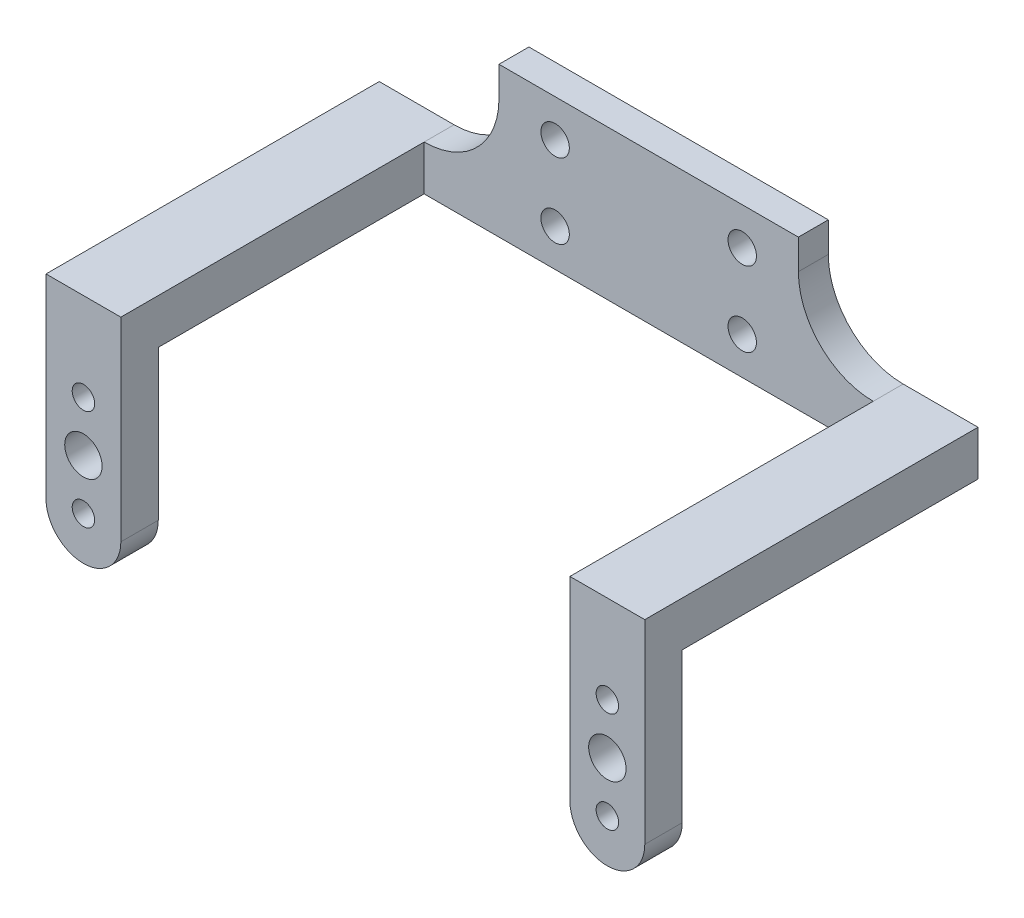
ISO-10303-21;
HEADER;
FILE_DESCRIPTION(('STEP AP214'),'2;1');
FILE_NAME('part.step','',(''),(''),'','','');
FILE_SCHEMA(('AUTOMOTIVE_DESIGN { 1 0 10303 214 1 1 1 1 }'));
ENDSEC;
DATA;
#1=APPLICATION_CONTEXT('core data for automotive mechanical design processes');
#2=APPLICATION_PROTOCOL_DEFINITION('international standard','automotive_design',2000,#1);
#3=PRODUCT_CONTEXT('',#1,'mechanical');
#4=PRODUCT('Part','Part','',(#3));
#5=PRODUCT_RELATED_PRODUCT_CATEGORY('part','',(#4));
#6=PRODUCT_DEFINITION_FORMATION('','',#4);
#7=PRODUCT_DEFINITION_CONTEXT('part definition',#1,'design');
#8=PRODUCT_DEFINITION('design','',#6,#7);
#9=PRODUCT_DEFINITION_SHAPE('','',#8);
#10=(LENGTH_UNIT() NAMED_UNIT(*) SI_UNIT(.MILLI.,.METRE.));
#11=(NAMED_UNIT(*) PLANE_ANGLE_UNIT() SI_UNIT($,.RADIAN.));
#12=(NAMED_UNIT(*) SI_UNIT($,.STERADIAN.) SOLID_ANGLE_UNIT());
#13=UNCERTAINTY_MEASURE_WITH_UNIT(LENGTH_MEASURE(1.E-05),#10,'distance_accuracy_value','');
#14=(GEOMETRIC_REPRESENTATION_CONTEXT(3) GLOBAL_UNCERTAINTY_ASSIGNED_CONTEXT((#13)) GLOBAL_UNIT_ASSIGNED_CONTEXT((#10,
#11,#12)) REPRESENTATION_CONTEXT('',''));
#15=CARTESIAN_POINT('',(0.,0.,0.));
#16=DIRECTION('',(0.,0.,1.));
#17=DIRECTION('',(1.,0.,0.));
#18=AXIS2_PLACEMENT_3D('',#15,#16,#17);
#19=CARTESIAN_POINT('',(0.,0.,44.52));
#20=DIRECTION('',(0.,0.,1.));
#21=DIRECTION('',(1.,0.,0.));
#22=AXIS2_PLACEMENT_3D('',#19,#20,#21);
#23=PLANE('',#22);
#24=CARTESIAN_POINT('',(35.,-5.77,44.52));
#25=DIRECTION('',(0.,0.,1.));
#26=DIRECTION('',(1.,0.,0.));
#27=AXIS2_PLACEMENT_3D('',#24,#25,#26);
#28=CIRCLE('',#27,1.5);
#29=CARTESIAN_POINT('',(36.5,-5.77,44.52));
#30=VERTEX_POINT('',#29);
#31=EDGE_CURVE('E401',#30,#30,#28,.F.);
#32=ORIENTED_EDGE('',*,*,#31,.T.);
#33=EDGE_LOOP('',(#32));
#34=FACE_BOUND('',#33,.T.);
#35=CARTESIAN_POINT('',(35.,-20.,44.52));
#36=DIRECTION('',(0.,0.,1.));
#37=DIRECTION('',(1.,0.,0.));
#38=AXIS2_PLACEMENT_3D('',#35,#36,#37);
#39=CIRCLE('',#38,5.);
#40=CARTESIAN_POINT('',(30.,-20.,44.52));
#41=VERTEX_POINT('',#40);
#42=CARTESIAN_POINT('',(35.,-25.,44.52));
#43=VERTEX_POINT('',#42);
#44=EDGE_CURVE('E299',#41,#43,#39,.T.);
#45=ORIENTED_EDGE('',*,*,#44,.T.);
#46=CARTESIAN_POINT('',(35.,-20.,44.52));
#47=DIRECTION('',(0.,0.,1.));
#48=DIRECTION('',(1.,0.,0.));
#49=AXIS2_PLACEMENT_3D('',#46,#47,#48);
#50=CIRCLE('',#49,5.);
#51=CARTESIAN_POINT('',(40.,-20.,44.52));
#52=VERTEX_POINT('',#51);
#53=EDGE_CURVE('E301',#43,#52,#50,.T.);
#54=ORIENTED_EDGE('',*,*,#53,.T.);
#55=DIRECTION('',(0.,1.,0.));
#56=VECTOR('',#55,1.);
#57=CARTESIAN_POINT('',(40.,0.,44.52));
#58=LINE('',#57,#56);
#59=CARTESIAN_POINT('',(40.,6.,44.52));
#60=VERTEX_POINT('',#59);
#61=EDGE_CURVE('E215',#52,#60,#58,.T.);
#62=ORIENTED_EDGE('',*,*,#61,.T.);
#63=DIRECTION('',(-1.,0.,0.));
#64=VECTOR('',#63,1.);
#65=CARTESIAN_POINT('',(40.,6.,44.52));
#66=LINE('',#65,#64);
#67=CARTESIAN_POINT('',(30.,6.,44.52));
#68=VERTEX_POINT('',#67);
#69=EDGE_CURVE('E272',#60,#68,#66,.T.);
#70=ORIENTED_EDGE('',*,*,#69,.T.);
#71=DIRECTION('',(0.,-1.,0.));
#72=VECTOR('',#71,1.);
#73=CARTESIAN_POINT('',(30.,0.,44.52));
#74=LINE('',#73,#72);
#75=EDGE_CURVE('E221',#68,#41,#74,.T.);
#76=ORIENTED_EDGE('',*,*,#75,.T.);
#77=EDGE_LOOP('',(#45,#54,#62,#70,#76));
#78=FACE_BOUND('',#77,.T.);
#79=CARTESIAN_POINT('',(35.,-12.5,44.52));
#80=DIRECTION('',(0.,0.,1.));
#81=DIRECTION('',(1.,0.,0.));
#82=AXIS2_PLACEMENT_3D('',#79,#80,#81);
#83=CIRCLE('',#82,2.5);
#84=CARTESIAN_POINT('',(37.5,-12.5,44.52));
#85=VERTEX_POINT('',#84);
#86=EDGE_CURVE('E389',#85,#85,#83,.F.);
#87=ORIENTED_EDGE('',*,*,#86,.T.);
#88=EDGE_LOOP('',(#87));
#89=FACE_BOUND('',#88,.T.);
#90=CARTESIAN_POINT('',(35.,-19.23,44.52));
#91=DIRECTION('',(0.,0.,1.));
#92=DIRECTION('',(1.,0.,0.));
#93=AXIS2_PLACEMENT_3D('',#90,#91,#92);
#94=CIRCLE('',#93,1.5);
#95=CARTESIAN_POINT('',(36.5,-19.23,44.52));
#96=VERTEX_POINT('',#95);
#97=EDGE_CURVE('E407',#96,#96,#94,.F.);
#98=ORIENTED_EDGE('',*,*,#97,.T.);
#99=EDGE_LOOP('',(#98));
#100=FACE_BOUND('',#99,.T.);
#101=ADVANCED_FACE('F33',(#34,#78,#89,#100),#23,.T.);
#102=CARTESIAN_POINT('',(30.,-25.,39.52));
#103=DIRECTION('',(0.,0.,1.));
#104=DIRECTION('',(1.,0.,0.));
#105=AXIS2_PLACEMENT_3D('',#102,#103,#104);
#106=PLANE('',#105);
#107=CARTESIAN_POINT('',(35.,-5.77,39.52));
#108=DIRECTION('',(0.,0.,1.));
#109=DIRECTION('',(1.,0.,0.));
#110=AXIS2_PLACEMENT_3D('',#107,#108,#109);
#111=CIRCLE('',#110,1.5);
#112=CARTESIAN_POINT('',(36.5,-5.77,39.52));
#113=VERTEX_POINT('',#112);
#114=EDGE_CURVE('E404',#113,#113,#111,.T.);
#115=ORIENTED_EDGE('',*,*,#114,.T.);
#116=EDGE_LOOP('',(#115));
#117=FACE_BOUND('',#116,.T.);
#118=DIRECTION('',(0.,1.,0.));
#119=VECTOR('',#118,1.);
#120=CARTESIAN_POINT('',(40.,-25.,39.52));
#121=LINE('',#120,#119);
#122=CARTESIAN_POINT('',(40.,-20.,39.52));
#123=VERTEX_POINT('',#122);
#124=CARTESIAN_POINT('',(40.,0.,39.52));
#125=VERTEX_POINT('',#124);
#126=EDGE_CURVE('E369',#123,#125,#121,.T.);
#127=ORIENTED_EDGE('',*,*,#126,.F.);
#128=CARTESIAN_POINT('',(35.,-20.,39.52));
#129=DIRECTION('',(0.,0.,1.));
#130=DIRECTION('',(1.,0.,0.));
#131=AXIS2_PLACEMENT_3D('',#128,#129,#130);
#132=CIRCLE('',#131,5.);
#133=CARTESIAN_POINT('',(35.,-25.,39.52));
#134=VERTEX_POINT('',#133);
#135=EDGE_CURVE('E308',#123,#134,#132,.F.);
#136=ORIENTED_EDGE('',*,*,#135,.T.);
#137=CARTESIAN_POINT('',(35.,-20.,39.52));
#138=DIRECTION('',(0.,0.,1.));
#139=DIRECTION('',(1.,0.,0.));
#140=AXIS2_PLACEMENT_3D('',#137,#138,#139);
#141=CIRCLE('',#140,5.);
#142=CARTESIAN_POINT('',(30.,-20.,39.52));
#143=VERTEX_POINT('',#142);
#144=EDGE_CURVE('E306',#134,#143,#141,.F.);
#145=ORIENTED_EDGE('',*,*,#144,.T.);
#146=DIRECTION('',(0.,1.,0.));
#147=VECTOR('',#146,1.);
#148=CARTESIAN_POINT('',(30.,-25.,39.52));
#149=LINE('',#148,#147);
#150=CARTESIAN_POINT('',(30.,0.,39.52));
#151=VERTEX_POINT('',#150);
#152=EDGE_CURVE('E248',#143,#151,#149,.T.);
#153=ORIENTED_EDGE('',*,*,#152,.T.);
#154=DIRECTION('',(1.,0.,0.));
#155=VECTOR('',#154,1.);
#156=CARTESIAN_POINT('',(30.,0.,39.52));
#157=LINE('',#156,#155);
#158=EDGE_CURVE('E363',#151,#125,#157,.T.);
#159=ORIENTED_EDGE('',*,*,#158,.T.);
#160=EDGE_LOOP('',(#127,#136,#145,#153,#159));
#161=FACE_BOUND('',#160,.T.);
#162=CARTESIAN_POINT('',(35.,-12.5,39.52));
#163=DIRECTION('',(0.,0.,1.));
#164=DIRECTION('',(1.,0.,0.));
#165=AXIS2_PLACEMENT_3D('',#162,#163,#164);
#166=CIRCLE('',#165,2.5);
#167=CARTESIAN_POINT('',(37.5,-12.5,39.52));
#168=VERTEX_POINT('',#167);
#169=EDGE_CURVE('E392',#168,#168,#166,.T.);
#170=ORIENTED_EDGE('',*,*,#169,.T.);
#171=EDGE_LOOP('',(#170));
#172=FACE_BOUND('',#171,.T.);
#173=CARTESIAN_POINT('',(35.,-19.23,39.52));
#174=DIRECTION('',(0.,0.,1.));
#175=DIRECTION('',(1.,0.,0.));
#176=AXIS2_PLACEMENT_3D('',#173,#174,#175);
#177=CIRCLE('',#176,1.5);
#178=CARTESIAN_POINT('',(36.5,-19.23,39.52));
#179=VERTEX_POINT('',#178);
#180=EDGE_CURVE('E410',#179,#179,#177,.T.);
#181=ORIENTED_EDGE('',*,*,#180,.T.);
#182=EDGE_LOOP('',(#181));
#183=FACE_BOUND('',#182,.T.);
#184=ADVANCED_FACE('F372',(#117,#161,#172,#183),#106,.F.);
#185=CARTESIAN_POINT('',(0.,0.,44.52));
#186=DIRECTION('',(0.,0.,1.));
#187=DIRECTION('',(1.,0.,0.));
#188=AXIS2_PLACEMENT_3D('',#185,#186,#187);
#189=PLANE('',#188);
#190=CARTESIAN_POINT('',(-35.,-5.76999999999999,44.52));
#191=DIRECTION('',(0.,0.,1.));
#192=DIRECTION('',(1.,0.,0.));
#193=AXIS2_PLACEMENT_3D('',#190,#191,#192);
#194=CIRCLE('',#193,1.5);
#195=CARTESIAN_POINT('',(-33.5,-5.76999999999999,44.52));
#196=VERTEX_POINT('',#195);
#197=EDGE_CURVE('E383',#196,#196,#194,.F.);
#198=ORIENTED_EDGE('',*,*,#197,.T.);
#199=EDGE_LOOP('',(#198));
#200=FACE_BOUND('',#199,.T.);
#201=DIRECTION('',(0.,-1.,0.));
#202=VECTOR('',#201,1.);
#203=CARTESIAN_POINT('',(-40.,0.,44.52));
#204=LINE('',#203,#202);
#205=CARTESIAN_POINT('',(-40.,6.,44.52));
#206=VERTEX_POINT('',#205);
#207=CARTESIAN_POINT('',(-40.,-20.,44.52));
#208=VERTEX_POINT('',#207);
#209=EDGE_CURVE('E260',#206,#208,#204,.T.);
#210=ORIENTED_EDGE('',*,*,#209,.T.);
#211=CARTESIAN_POINT('',(-35.,-20.,44.52));
#212=DIRECTION('',(0.,0.,1.));
#213=DIRECTION('',(1.,0.,0.));
#214=AXIS2_PLACEMENT_3D('',#211,#212,#213);
#215=CIRCLE('',#214,5.);
#216=CARTESIAN_POINT('',(-35.,-25.,44.52));
#217=VERTEX_POINT('',#216);
#218=EDGE_CURVE('E42',#208,#217,#215,.T.);
#219=ORIENTED_EDGE('',*,*,#218,.T.);
#220=CARTESIAN_POINT('',(-35.,-20.,44.52));
#221=DIRECTION('',(0.,0.,1.));
#222=DIRECTION('',(1.,0.,0.));
#223=AXIS2_PLACEMENT_3D('',#220,#221,#222);
#224=CIRCLE('',#223,5.);
#225=CARTESIAN_POINT('',(-30.,-20.,44.52));
#226=VERTEX_POINT('',#225);
#227=EDGE_CURVE('E50',#217,#226,#224,.T.);
#228=ORIENTED_EDGE('',*,*,#227,.T.);
#229=DIRECTION('',(0.,1.,0.));
#230=VECTOR('',#229,1.);
#231=CARTESIAN_POINT('',(-30.,0.,44.52));
#232=LINE('',#231,#230);
#233=CARTESIAN_POINT('',(-30.,6.,44.52));
#234=VERTEX_POINT('',#233);
#235=EDGE_CURVE('E255',#226,#234,#232,.T.);
#236=ORIENTED_EDGE('',*,*,#235,.T.);
#237=DIRECTION('',(-1.,0.,0.));
#238=VECTOR('',#237,1.);
#239=CARTESIAN_POINT('',(-40.,6.,44.52));
#240=LINE('',#239,#238);
#241=EDGE_CURVE('E257',#234,#206,#240,.T.);
#242=ORIENTED_EDGE('',*,*,#241,.T.);
#243=EDGE_LOOP('',(#210,#219,#228,#236,#242));
#244=FACE_BOUND('',#243,.T.);
#245=CARTESIAN_POINT('',(-35.,-19.23,44.52));
#246=DIRECTION('',(0.,0.,1.));
#247=DIRECTION('',(1.,0.,0.));
#248=AXIS2_PLACEMENT_3D('',#245,#246,#247);
#249=CIRCLE('',#248,1.5);
#250=CARTESIAN_POINT('',(-33.5,-19.23,44.52));
#251=VERTEX_POINT('',#250);
#252=EDGE_CURVE('E375',#251,#251,#249,.F.);
#253=ORIENTED_EDGE('',*,*,#252,.T.);
#254=EDGE_LOOP('',(#253));
#255=FACE_BOUND('',#254,.T.);
#256=CARTESIAN_POINT('',(-35.,-12.5,44.52));
#257=DIRECTION('',(0.,0.,1.));
#258=DIRECTION('',(1.,0.,0.));
#259=AXIS2_PLACEMENT_3D('',#256,#257,#258);
#260=CIRCLE('',#259,2.49999999999999);
#261=CARTESIAN_POINT('',(-32.5,-12.5,44.52));
#262=VERTEX_POINT('',#261);
#263=EDGE_CURVE('E395',#262,#262,#260,.F.);
#264=ORIENTED_EDGE('',*,*,#263,.T.);
#265=EDGE_LOOP('',(#264));
#266=FACE_BOUND('',#265,.T.);
#267=ADVANCED_FACE('F457',(#200,#244,#255,#266),#189,.T.);
#268=CARTESIAN_POINT('',(-30.,-25.,39.52));
#269=DIRECTION('',(0.,0.,1.));
#270=DIRECTION('',(1.,0.,0.));
#271=AXIS2_PLACEMENT_3D('',#268,#269,#270);
#272=PLANE('',#271);
#273=CARTESIAN_POINT('',(-35.,-5.76999999999999,39.52));
#274=DIRECTION('',(0.,0.,1.));
#275=DIRECTION('',(-1.,0.,0.));
#276=AXIS2_PLACEMENT_3D('',#273,#274,#275);
#277=CIRCLE('',#276,1.5);
#278=CARTESIAN_POINT('',(-36.5,-5.76999999999999,39.52));
#279=VERTEX_POINT('',#278);
#280=EDGE_CURVE('E386',#279,#279,#277,.T.);
#281=ORIENTED_EDGE('',*,*,#280,.T.);
#282=EDGE_LOOP('',(#281));
#283=FACE_BOUND('',#282,.T.);
#284=CARTESIAN_POINT('',(-35.,-20.,39.52));
#285=DIRECTION('',(0.,0.,1.));
#286=DIRECTION('',(1.,0.,0.));
#287=AXIS2_PLACEMENT_3D('',#284,#285,#286);
#288=CIRCLE('',#287,5.);
#289=CARTESIAN_POINT('',(-30.,-20.,39.52));
#290=VERTEX_POINT('',#289);
#291=CARTESIAN_POINT('',(-35.,-25.,39.52));
#292=VERTEX_POINT('',#291);
#293=EDGE_CURVE('E312',#290,#292,#288,.F.);
#294=ORIENTED_EDGE('',*,*,#293,.T.);
#295=CARTESIAN_POINT('',(-35.,-20.,39.52));
#296=DIRECTION('',(0.,0.,1.));
#297=DIRECTION('',(1.,0.,0.));
#298=AXIS2_PLACEMENT_3D('',#295,#296,#297);
#299=CIRCLE('',#298,5.);
#300=CARTESIAN_POINT('',(-40.,-20.,39.52));
#301=VERTEX_POINT('',#300);
#302=EDGE_CURVE('E316',#292,#301,#299,.F.);
#303=ORIENTED_EDGE('',*,*,#302,.T.);
#304=DIRECTION('',(0.,1.,0.));
#305=VECTOR('',#304,1.);
#306=CARTESIAN_POINT('',(-40.,-25.,39.52));
#307=LINE('',#306,#305);
#308=CARTESIAN_POINT('',(-40.,0.,39.52));
#309=VERTEX_POINT('',#308);
#310=EDGE_CURVE('E265',#301,#309,#307,.T.);
#311=ORIENTED_EDGE('',*,*,#310,.T.);
#312=DIRECTION('',(1.,0.,0.));
#313=VECTOR('',#312,1.);
#314=CARTESIAN_POINT('',(-30.,0.,39.52));
#315=LINE('',#314,#313);
#316=CARTESIAN_POINT('',(-30.,0.,39.52));
#317=VERTEX_POINT('',#316);
#318=EDGE_CURVE('E243',#309,#317,#315,.T.);
#319=ORIENTED_EDGE('',*,*,#318,.T.);
#320=DIRECTION('',(0.,1.,0.));
#321=VECTOR('',#320,1.);
#322=CARTESIAN_POINT('',(-30.,-25.,39.52));
#323=LINE('',#322,#321);
#324=EDGE_CURVE('E247',#290,#317,#323,.T.);
#325=ORIENTED_EDGE('',*,*,#324,.F.);
#326=EDGE_LOOP('',(#294,#303,#311,#319,#325));
#327=FACE_BOUND('',#326,.T.);
#328=CARTESIAN_POINT('',(-35.,-19.23,39.52));
#329=DIRECTION('',(0.,0.,1.));
#330=DIRECTION('',(-1.,0.,0.));
#331=AXIS2_PLACEMENT_3D('',#328,#329,#330);
#332=CIRCLE('',#331,1.5);
#333=CARTESIAN_POINT('',(-36.5,-19.23,39.52));
#334=VERTEX_POINT('',#333);
#335=EDGE_CURVE('E378',#334,#334,#332,.T.);
#336=ORIENTED_EDGE('',*,*,#335,.T.);
#337=EDGE_LOOP('',(#336));
#338=FACE_BOUND('',#337,.T.);
#339=CARTESIAN_POINT('',(-35.,-12.5,39.52));
#340=DIRECTION('',(0.,0.,1.));
#341=DIRECTION('',(-1.,0.,0.));
#342=AXIS2_PLACEMENT_3D('',#339,#340,#341);
#343=CIRCLE('',#342,2.49999999999999);
#344=CARTESIAN_POINT('',(-37.5,-12.5,39.52));
#345=VERTEX_POINT('',#344);
#346=EDGE_CURVE('E398',#345,#345,#343,.T.);
#347=ORIENTED_EDGE('',*,*,#346,.T.);
#348=EDGE_LOOP('',(#347));
#349=FACE_BOUND('',#348,.T.);
#350=ADVANCED_FACE('F341',(#283,#327,#338,#349),#272,.F.);
#351=CARTESIAN_POINT('',(-20.,0.,4.));
#352=DIRECTION('',(0.,1.,0.));
#353=DIRECTION('',(0.,0.,1.));
#354=AXIS2_PLACEMENT_3D('',#351,#352,#353);
#355=PLANE('',#354);
#356=ORIENTED_EDGE('',*,*,#158,.F.);
#357=DIRECTION('',(0.,0.,-1.));
#358=VECTOR('',#357,1.);
#359=CARTESIAN_POINT('',(30.,0.,44.52));
#360=LINE('',#359,#358);
#361=CARTESIAN_POINT('',(30.,0.,4.));
#362=VERTEX_POINT('',#361);
#363=EDGE_CURVE('E225',#151,#362,#360,.T.);
#364=ORIENTED_EDGE('',*,*,#363,.T.);
#365=DIRECTION('',(1.,0.,0.));
#366=VECTOR('',#365,1.);
#367=CARTESIAN_POINT('',(-20.,0.,4.));
#368=LINE('',#367,#366);
#369=CARTESIAN_POINT('',(-30.,0.,4.));
#370=VERTEX_POINT('',#369);
#371=EDGE_CURVE('E188',#370,#362,#368,.T.);
#372=ORIENTED_EDGE('',*,*,#371,.F.);
#373=DIRECTION('',(0.,0.,-1.));
#374=VECTOR('',#373,1.);
#375=CARTESIAN_POINT('',(-30.,0.,44.52));
#376=LINE('',#375,#374);
#377=EDGE_CURVE('E216',#317,#370,#376,.T.);
#378=ORIENTED_EDGE('',*,*,#377,.F.);
#379=ORIENTED_EDGE('',*,*,#318,.F.);
#380=DIRECTION('',(0.,0.,-1.));
#381=VECTOR('',#380,1.);
#382=CARTESIAN_POINT('',(-40.,0.,32.2842712474619));
#383=LINE('',#382,#381);
#384=CARTESIAN_POINT('',(-40.,0.,0.));
#385=VERTEX_POINT('',#384);
#386=EDGE_CURVE('E233',#309,#385,#383,.T.);
#387=ORIENTED_EDGE('',*,*,#386,.T.);
#388=DIRECTION('',(1.,0.,0.));
#389=VECTOR('',#388,1.);
#390=CARTESIAN_POINT('',(-20.,0.,0.));
#391=LINE('',#390,#389);
#392=CARTESIAN_POINT('',(40.,0.,0.));
#393=VERTEX_POINT('',#392);
#394=EDGE_CURVE('E200',#385,#393,#391,.T.);
#395=ORIENTED_EDGE('',*,*,#394,.T.);
#396=DIRECTION('',(0.,0.,-1.));
#397=VECTOR('',#396,1.);
#398=CARTESIAN_POINT('',(40.,0.,32.2842712474619));
#399=LINE('',#398,#397);
#400=EDGE_CURVE('E227',#125,#393,#399,.T.);
#401=ORIENTED_EDGE('',*,*,#400,.F.);
#402=EDGE_LOOP('',(#356,#364,#372,#378,#379,#387,#395,#401));
#403=FACE_BOUND('',#402,.T.);
#404=ADVANCED_FACE('F346',(#403),#355,.F.);
#405=CARTESIAN_POINT('',(0.,0.,4.));
#406=DIRECTION('',(0.,0.,-1.));
#407=DIRECTION('',(-1.,0.,0.));
#408=AXIS2_PLACEMENT_3D('',#405,#406,#407);
#409=PLANE('',#408);
#410=CARTESIAN_POINT('',(12.5,5.,4.));
#411=DIRECTION('',(0.,0.,1.));
#412=DIRECTION('',(-1.,0.,0.));
#413=AXIS2_PLACEMENT_3D('',#410,#411,#412);
#414=CIRCLE('',#413,1.90000000000001);
#415=CARTESIAN_POINT('',(10.6,5.,4.));
#416=VERTEX_POINT('',#415);
#417=EDGE_CURVE('E813',#416,#416,#414,.T.);
#418=ORIENTED_EDGE('',*,*,#417,.F.);
#419=EDGE_LOOP('',(#418));
#420=FACE_BOUND('',#419,.T.);
#421=CARTESIAN_POINT('',(-12.5,15.,4.));
#422=DIRECTION('',(0.,0.,1.));
#423=DIRECTION('',(1.,0.,0.));
#424=AXIS2_PLACEMENT_3D('',#421,#422,#423);
#425=CIRCLE('',#424,1.9);
#426=CARTESIAN_POINT('',(-10.6,15.,4.));
#427=VERTEX_POINT('',#426);
#428=EDGE_CURVE('E203',#427,#427,#425,.T.);
#429=ORIENTED_EDGE('',*,*,#428,.F.);
#430=EDGE_LOOP('',(#429));
#431=FACE_BOUND('',#430,.T.);
#432=CARTESIAN_POINT('',(-12.5,5.,4.));
#433=DIRECTION('',(0.,0.,1.));
#434=DIRECTION('',(1.,0.,0.));
#435=AXIS2_PLACEMENT_3D('',#432,#433,#434);
#436=CIRCLE('',#435,1.9);
#437=CARTESIAN_POINT('',(-10.6,5.,4.));
#438=VERTEX_POINT('',#437);
#439=EDGE_CURVE('E820',#438,#438,#436,.T.);
#440=ORIENTED_EDGE('',*,*,#439,.F.);
#441=EDGE_LOOP('',(#440));
#442=FACE_BOUND('',#441,.T.);
#443=CARTESIAN_POINT('',(12.5,15.,4.));
#444=DIRECTION('',(0.,0.,1.));
#445=DIRECTION('',(-1.,0.,0.));
#446=AXIS2_PLACEMENT_3D('',#443,#444,#445);
#447=CIRCLE('',#446,1.90000000000001);
#448=CARTESIAN_POINT('',(10.6,15.,4.));
#449=VERTEX_POINT('',#448);
#450=EDGE_CURVE('E236',#449,#449,#447,.T.);
#451=ORIENTED_EDGE('',*,*,#450,.F.);
#452=EDGE_LOOP('',(#451));
#453=FACE_BOUND('',#452,.T.);
#454=DIRECTION('',(0.,-1.,0.));
#455=VECTOR('',#454,1.);
#456=CARTESIAN_POINT('',(30.,0.,4.));
#457=LINE('',#456,#455);
#458=CARTESIAN_POINT('',(30.,6.,4.));
#459=VERTEX_POINT('',#458);
#460=EDGE_CURVE('E211',#459,#362,#457,.T.);
#461=ORIENTED_EDGE('',*,*,#460,.F.);
#462=CARTESIAN_POINT('',(30.,16.,4.));
#463=DIRECTION('',(0.,0.,-1.));
#464=DIRECTION('',(-1.,0.,0.));
#465=AXIS2_PLACEMENT_3D('',#462,#463,#464);
#466=CIRCLE('',#465,10.);
#467=CARTESIAN_POINT('',(20.,16.,4.));
#468=VERTEX_POINT('',#467);
#469=EDGE_CURVE('E181',#459,#468,#466,.T.);
#470=ORIENTED_EDGE('',*,*,#469,.T.);
#471=DIRECTION('',(0.,-1.,0.));
#472=VECTOR('',#471,1.);
#473=CARTESIAN_POINT('',(20.,6.,4.));
#474=LINE('',#473,#472);
#475=CARTESIAN_POINT('',(20.,20.,4.));
#476=VERTEX_POINT('',#475);
#477=EDGE_CURVE('E165',#476,#468,#474,.T.);
#478=ORIENTED_EDGE('',*,*,#477,.F.);
#479=DIRECTION('',(-1.,0.,0.));
#480=VECTOR('',#479,1.);
#481=CARTESIAN_POINT('',(-20.,20.,4.));
#482=LINE('',#481,#480);
#483=CARTESIAN_POINT('',(-20.,20.,4.));
#484=VERTEX_POINT('',#483);
#485=EDGE_CURVE('E179',#476,#484,#482,.T.);
#486=ORIENTED_EDGE('',*,*,#485,.T.);
#487=DIRECTION('',(0.,1.,0.));
#488=VECTOR('',#487,1.);
#489=CARTESIAN_POINT('',(-20.,6.,4.));
#490=LINE('',#489,#488);
#491=CARTESIAN_POINT('',(-20.,16.,4.));
#492=VERTEX_POINT('',#491);
#493=EDGE_CURVE('E418',#492,#484,#490,.T.);
#494=ORIENTED_EDGE('',*,*,#493,.F.);
#495=CARTESIAN_POINT('',(-30.,16.,4.));
#496=DIRECTION('',(0.,0.,-1.));
#497=DIRECTION('',(-1.,0.,0.));
#498=AXIS2_PLACEMENT_3D('',#495,#496,#497);
#499=CIRCLE('',#498,10.);
#500=CARTESIAN_POINT('',(-30.,6.,4.));
#501=VERTEX_POINT('',#500);
#502=EDGE_CURVE('E295',#492,#501,#499,.T.);
#503=ORIENTED_EDGE('',*,*,#502,.T.);
#504=DIRECTION('',(0.,1.,0.));
#505=VECTOR('',#504,1.);
#506=CARTESIAN_POINT('',(-30.,0.,4.));
#507=LINE('',#506,#505);
#508=EDGE_CURVE('E258',#370,#501,#507,.T.);
#509=ORIENTED_EDGE('',*,*,#508,.F.);
#510=ORIENTED_EDGE('',*,*,#371,.T.);
#511=EDGE_LOOP('',(#461,#470,#478,#486,#494,#503,#509,#510));
#512=FACE_BOUND('',#511,.T.);
#513=ADVANCED_FACE('F177',(#420,#431,#442,#453,#512),#409,.F.);
#514=CARTESIAN_POINT('',(0.,0.,0.));
#515=DIRECTION('',(0.,0.,-1.));
#516=DIRECTION('',(-1.,0.,0.));
#517=AXIS2_PLACEMENT_3D('',#514,#515,#516);
#518=PLANE('',#517);
#519=DIRECTION('',(-1.,0.,0.));
#520=VECTOR('',#519,1.);
#521=CARTESIAN_POINT('',(0.,6.,0.));
#522=LINE('',#521,#520);
#523=CARTESIAN_POINT('',(40.,6.,0.));
#524=VERTEX_POINT('',#523);
#525=CARTESIAN_POINT('',(30.,6.,0.));
#526=VERTEX_POINT('',#525);
#527=EDGE_CURVE('E172',#524,#526,#522,.T.);
#528=ORIENTED_EDGE('',*,*,#527,.F.);
#529=DIRECTION('',(0.,-1.,0.));
#530=VECTOR('',#529,1.);
#531=CARTESIAN_POINT('',(40.,0.,0.));
#532=LINE('',#531,#530);
#533=EDGE_CURVE('E207',#524,#393,#532,.T.);
#534=ORIENTED_EDGE('',*,*,#533,.T.);
#535=ORIENTED_EDGE('',*,*,#394,.F.);
#536=DIRECTION('',(0.,1.,0.));
#537=VECTOR('',#536,1.);
#538=CARTESIAN_POINT('',(-40.,0.,0.));
#539=LINE('',#538,#537);
#540=CARTESIAN_POINT('',(-40.,6.,0.));
#541=VERTEX_POINT('',#540);
#542=EDGE_CURVE('E230',#385,#541,#539,.T.);
#543=ORIENTED_EDGE('',*,*,#542,.T.);
#544=DIRECTION('',(-1.,0.,0.));
#545=VECTOR('',#544,1.);
#546=CARTESIAN_POINT('',(0.,6.,0.));
#547=LINE('',#546,#545);
#548=CARTESIAN_POINT('',(-30.,6.,0.));
#549=VERTEX_POINT('',#548);
#550=EDGE_CURVE('E358',#549,#541,#547,.T.);
#551=ORIENTED_EDGE('',*,*,#550,.F.);
#552=CARTESIAN_POINT('',(-30.,16.,0.));
#553=DIRECTION('',(0.,0.,-1.));
#554=DIRECTION('',(-1.,0.,0.));
#555=AXIS2_PLACEMENT_3D('',#552,#553,#554);
#556=CIRCLE('',#555,10.);
#557=CARTESIAN_POINT('',(-20.,16.,0.));
#558=VERTEX_POINT('',#557);
#559=EDGE_CURVE('E297',#549,#558,#556,.F.);
#560=ORIENTED_EDGE('',*,*,#559,.T.);
#561=DIRECTION('',(0.,-1.,0.));
#562=VECTOR('',#561,1.);
#563=CARTESIAN_POINT('',(-20.,0.,0.));
#564=LINE('',#563,#562);
#565=CARTESIAN_POINT('',(-20.,20.,0.));
#566=VERTEX_POINT('',#565);
#567=EDGE_CURVE('E413',#566,#558,#564,.T.);
#568=ORIENTED_EDGE('',*,*,#567,.F.);
#569=DIRECTION('',(-1.,0.,0.));
#570=VECTOR('',#569,1.);
#571=CARTESIAN_POINT('',(-20.,20.,0.));
#572=LINE('',#571,#570);
#573=CARTESIAN_POINT('',(20.,20.,0.));
#574=VERTEX_POINT('',#573);
#575=EDGE_CURVE('E194',#574,#566,#572,.T.);
#576=ORIENTED_EDGE('',*,*,#575,.F.);
#577=DIRECTION('',(0.,1.,0.));
#578=VECTOR('',#577,1.);
#579=CARTESIAN_POINT('',(20.,0.,0.));
#580=LINE('',#579,#578);
#581=CARTESIAN_POINT('',(20.,16.,0.));
#582=VERTEX_POINT('',#581);
#583=EDGE_CURVE('E168',#582,#574,#580,.T.);
#584=ORIENTED_EDGE('',*,*,#583,.F.);
#585=CARTESIAN_POINT('',(30.,16.,0.));
#586=DIRECTION('',(0.,0.,-1.));
#587=DIRECTION('',(-1.,0.,0.));
#588=AXIS2_PLACEMENT_3D('',#585,#586,#587);
#589=CIRCLE('',#588,10.);
#590=EDGE_CURVE('E293',#582,#526,#589,.F.);
#591=ORIENTED_EDGE('',*,*,#590,.T.);
#592=EDGE_LOOP('',(#528,#534,#535,#543,#551,#560,#568,#576,#584,#591));
#593=FACE_BOUND('',#592,.T.);
#594=CARTESIAN_POINT('',(12.5,5.,0.));
#595=DIRECTION('',(0.,0.,1.));
#596=DIRECTION('',(-1.,0.,0.));
#597=AXIS2_PLACEMENT_3D('',#594,#595,#596);
#598=CIRCLE('',#597,1.90000000000001);
#599=CARTESIAN_POINT('',(10.6,5.,0.));
#600=VERTEX_POINT('',#599);
#601=EDGE_CURVE('E823',#600,#600,#598,.T.);
#602=ORIENTED_EDGE('',*,*,#601,.T.);
#603=EDGE_LOOP('',(#602));
#604=FACE_BOUND('',#603,.T.);
#605=CARTESIAN_POINT('',(-12.5,15.,0.));
#606=DIRECTION('',(0.,0.,1.));
#607=DIRECTION('',(1.,0.,0.));
#608=AXIS2_PLACEMENT_3D('',#605,#606,#607);
#609=CIRCLE('',#608,1.9);
#610=CARTESIAN_POINT('',(-10.6,15.,0.));
#611=VERTEX_POINT('',#610);
#612=EDGE_CURVE('E833',#611,#611,#609,.T.);
#613=ORIENTED_EDGE('',*,*,#612,.T.);
#614=EDGE_LOOP('',(#613));
#615=FACE_BOUND('',#614,.T.);
#616=CARTESIAN_POINT('',(-12.5,5.,0.));
#617=DIRECTION('',(0.,0.,1.));
#618=DIRECTION('',(1.,0.,0.));
#619=AXIS2_PLACEMENT_3D('',#616,#617,#618);
#620=CIRCLE('',#619,1.9);
#621=CARTESIAN_POINT('',(-10.6,5.,0.));
#622=VERTEX_POINT('',#621);
#623=EDGE_CURVE('E830',#622,#622,#620,.T.);
#624=ORIENTED_EDGE('',*,*,#623,.T.);
#625=EDGE_LOOP('',(#624));
#626=FACE_BOUND('',#625,.T.);
#627=CARTESIAN_POINT('',(12.5,15.,0.));
#628=DIRECTION('',(0.,0.,1.));
#629=DIRECTION('',(-1.,0.,0.));
#630=AXIS2_PLACEMENT_3D('',#627,#628,#629);
#631=CIRCLE('',#630,1.90000000000001);
#632=CARTESIAN_POINT('',(10.6,15.,0.));
#633=VERTEX_POINT('',#632);
#634=EDGE_CURVE('E241',#633,#633,#631,.T.);
#635=ORIENTED_EDGE('',*,*,#634,.T.);
#636=EDGE_LOOP('',(#635));
#637=FACE_BOUND('',#636,.T.);
#638=ADVANCED_FACE('F356',(#593,#604,#615,#626,#637),#518,.T.);
#639=CARTESIAN_POINT('',(-20.,20.,4.));
#640=DIRECTION('',(0.,-1.,0.));
#641=DIRECTION('',(0.,0.,-1.));
#642=AXIS2_PLACEMENT_3D('',#639,#640,#641);
#643=PLANE('',#642);
#644=ORIENTED_EDGE('',*,*,#485,.F.);
#645=DIRECTION('',(0.,0.,1.));
#646=VECTOR('',#645,1.);
#647=CARTESIAN_POINT('',(20.,20.,-2.49999999998515E-05));
#648=LINE('',#647,#646);
#649=EDGE_CURVE('E162',#574,#476,#648,.T.);
#650=ORIENTED_EDGE('',*,*,#649,.F.);
#651=ORIENTED_EDGE('',*,*,#575,.T.);
#652=DIRECTION('',(0.,0.,1.));
#653=VECTOR('',#652,1.);
#654=CARTESIAN_POINT('',(-20.,20.,-2.49999999998515E-05));
#655=LINE('',#654,#653);
#656=EDGE_CURVE('E186',#566,#484,#655,.T.);
#657=ORIENTED_EDGE('',*,*,#656,.T.);
#658=EDGE_LOOP('',(#644,#650,#651,#657));
#659=FACE_BOUND('',#658,.T.);
#660=ADVANCED_FACE('F184',(#659),#643,.F.);
#661=CARTESIAN_POINT('',(-12.5,15.,4.));
#662=DIRECTION('',(0.,0.,-1.));
#663=DIRECTION('',(-1.,0.,0.));
#664=AXIS2_PLACEMENT_3D('',#661,#662,#663);
#665=CYLINDRICAL_SURFACE('',#664,1.9);
#666=ORIENTED_EDGE('',*,*,#428,.T.);
#667=EDGE_LOOP('',(#666));
#668=FACE_BOUND('',#667,.T.);
#669=ORIENTED_EDGE('',*,*,#612,.F.);
#670=EDGE_LOOP('',(#669));
#671=FACE_BOUND('',#670,.T.);
#672=ADVANCED_FACE('F484',(#668,#671),#665,.F.);
#673=CARTESIAN_POINT('',(-12.5,5.,4.));
#674=DIRECTION('',(0.,0.,-1.));
#675=DIRECTION('',(-1.,0.,0.));
#676=AXIS2_PLACEMENT_3D('',#673,#674,#675);
#677=CYLINDRICAL_SURFACE('',#676,1.9);
#678=ORIENTED_EDGE('',*,*,#439,.T.);
#679=EDGE_LOOP('',(#678));
#680=FACE_BOUND('',#679,.T.);
#681=ORIENTED_EDGE('',*,*,#623,.F.);
#682=EDGE_LOOP('',(#681));
#683=FACE_BOUND('',#682,.T.);
#684=ADVANCED_FACE('F480',(#680,#683),#677,.F.);
#685=CARTESIAN_POINT('',(12.5,5.,4.));
#686=DIRECTION('',(0.,0.,-1.));
#687=DIRECTION('',(-1.,0.,0.));
#688=AXIS2_PLACEMENT_3D('',#685,#686,#687);
#689=CYLINDRICAL_SURFACE('',#688,1.90000000000001);
#690=ORIENTED_EDGE('',*,*,#417,.T.);
#691=EDGE_LOOP('',(#690));
#692=FACE_BOUND('',#691,.T.);
#693=ORIENTED_EDGE('',*,*,#601,.F.);
#694=EDGE_LOOP('',(#693));
#695=FACE_BOUND('',#694,.T.);
#696=ADVANCED_FACE('F476',(#692,#695),#689,.F.);
#697=CARTESIAN_POINT('',(12.5,15.,4.));
#698=DIRECTION('',(0.,0.,-1.));
#699=DIRECTION('',(-1.,0.,0.));
#700=AXIS2_PLACEMENT_3D('',#697,#698,#699);
#701=CYLINDRICAL_SURFACE('',#700,1.90000000000001);
#702=ORIENTED_EDGE('',*,*,#450,.T.);
#703=EDGE_LOOP('',(#702));
#704=FACE_BOUND('',#703,.T.);
#705=ORIENTED_EDGE('',*,*,#634,.F.);
#706=EDGE_LOOP('',(#705));
#707=FACE_BOUND('',#706,.T.);
#708=ADVANCED_FACE('F473',(#704,#707),#701,.F.);
#709=CARTESIAN_POINT('',(-40.,0.,32.2842712474619));
#710=DIRECTION('',(-1.,0.,0.));
#711=DIRECTION('',(0.,0.,1.));
#712=AXIS2_PLACEMENT_3D('',#709,#710,#711);
#713=PLANE('',#712);
#714=ORIENTED_EDGE('',*,*,#310,.F.);
#715=DIRECTION('',(0.,0.,-1.));
#716=VECTOR('',#715,1.);
#717=CARTESIAN_POINT('',(-40.,-20.,44.52));
#718=LINE('',#717,#716);
#719=EDGE_CURVE('E318',#301,#208,#718,.F.);
#720=ORIENTED_EDGE('',*,*,#719,.T.);
#721=ORIENTED_EDGE('',*,*,#209,.F.);
#722=DIRECTION('',(0.,0.,-1.));
#723=VECTOR('',#722,1.);
#724=CARTESIAN_POINT('',(-40.,6.,44.52));
#725=LINE('',#724,#723);
#726=EDGE_CURVE('E262',#206,#541,#725,.T.);
#727=ORIENTED_EDGE('',*,*,#726,.T.);
#728=ORIENTED_EDGE('',*,*,#542,.F.);
#729=ORIENTED_EDGE('',*,*,#386,.F.);
#730=EDGE_LOOP('',(#714,#720,#721,#727,#728,#729));
#731=FACE_BOUND('',#730,.T.);
#732=ADVANCED_FACE('F350',(#731),#713,.T.);
#733=CARTESIAN_POINT('',(40.,0.,32.2842712474619));
#734=DIRECTION('',(1.,0.,0.));
#735=DIRECTION('',(0.,0.,-1.));
#736=AXIS2_PLACEMENT_3D('',#733,#734,#735);
#737=PLANE('',#736);
#738=ORIENTED_EDGE('',*,*,#61,.F.);
#739=DIRECTION('',(0.,0.,1.));
#740=VECTOR('',#739,1.);
#741=CARTESIAN_POINT('',(40.,-20.,39.52));
#742=LINE('',#741,#740);
#743=EDGE_CURVE('E303',#52,#123,#742,.F.);
#744=ORIENTED_EDGE('',*,*,#743,.T.);
#745=ORIENTED_EDGE('',*,*,#126,.T.);
#746=ORIENTED_EDGE('',*,*,#400,.T.);
#747=ORIENTED_EDGE('',*,*,#533,.F.);
#748=DIRECTION('',(0.,0.,-1.));
#749=VECTOR('',#748,1.);
#750=CARTESIAN_POINT('',(40.,6.,44.52));
#751=LINE('',#750,#749);
#752=EDGE_CURVE('E205',#60,#524,#751,.T.);
#753=ORIENTED_EDGE('',*,*,#752,.F.);
#754=EDGE_LOOP('',(#738,#744,#745,#746,#747,#753));
#755=FACE_BOUND('',#754,.T.);
#756=ADVANCED_FACE('F366',(#755),#737,.T.);
#757=CARTESIAN_POINT('',(40.,6.,44.52));
#758=DIRECTION('',(0.,-1.,0.));
#759=DIRECTION('',(0.,0.,-1.));
#760=AXIS2_PLACEMENT_3D('',#757,#758,#759);
#761=PLANE('',#760);
#762=ORIENTED_EDGE('',*,*,#527,.T.);
#763=DIRECTION('',(0.,0.,1.));
#764=VECTOR('',#763,1.);
#765=CARTESIAN_POINT('',(30.,6.,4.));
#766=LINE('',#765,#764);
#767=EDGE_CURVE('E187',#526,#459,#766,.T.);
#768=ORIENTED_EDGE('',*,*,#767,.T.);
#769=DIRECTION('',(0.,0.,-1.));
#770=VECTOR('',#769,1.);
#771=CARTESIAN_POINT('',(30.,6.,44.52));
#772=LINE('',#771,#770);
#773=EDGE_CURVE('E208',#68,#459,#772,.T.);
#774=ORIENTED_EDGE('',*,*,#773,.F.);
#775=ORIENTED_EDGE('',*,*,#69,.F.);
#776=ORIENTED_EDGE('',*,*,#752,.T.);
#777=EDGE_LOOP('',(#762,#768,#774,#775,#776));
#778=FACE_BOUND('',#777,.T.);
#779=ADVANCED_FACE('F424',(#778),#761,.F.);
#780=CARTESIAN_POINT('',(30.,0.,44.52));
#781=DIRECTION('',(1.,0.,0.));
#782=DIRECTION('',(0.,0.,-1.));
#783=AXIS2_PLACEMENT_3D('',#780,#781,#782);
#784=PLANE('',#783);
#785=ORIENTED_EDGE('',*,*,#152,.F.);
#786=DIRECTION('',(0.,0.,-1.));
#787=VECTOR('',#786,1.);
#788=CARTESIAN_POINT('',(30.,-20.,44.52));
#789=LINE('',#788,#787);
#790=EDGE_CURVE('E310',#143,#41,#789,.F.);
#791=ORIENTED_EDGE('',*,*,#790,.T.);
#792=ORIENTED_EDGE('',*,*,#75,.F.);
#793=ORIENTED_EDGE('',*,*,#773,.T.);
#794=ORIENTED_EDGE('',*,*,#460,.T.);
#795=ORIENTED_EDGE('',*,*,#363,.F.);
#796=EDGE_LOOP('',(#785,#791,#792,#793,#794,#795));
#797=FACE_BOUND('',#796,.T.);
#798=ADVANCED_FACE('F463',(#797),#784,.F.);
#799=CARTESIAN_POINT('',(-30.,0.,44.52));
#800=DIRECTION('',(-1.,0.,0.));
#801=DIRECTION('',(0.,0.,1.));
#802=AXIS2_PLACEMENT_3D('',#799,#800,#801);
#803=PLANE('',#802);
#804=ORIENTED_EDGE('',*,*,#235,.F.);
#805=DIRECTION('',(0.,0.,1.));
#806=VECTOR('',#805,1.);
#807=CARTESIAN_POINT('',(-30.,-20.,44.52));
#808=LINE('',#807,#806);
#809=EDGE_CURVE('E11',#226,#290,#808,.F.);
#810=ORIENTED_EDGE('',*,*,#809,.T.);
#811=ORIENTED_EDGE('',*,*,#324,.T.);
#812=ORIENTED_EDGE('',*,*,#377,.T.);
#813=ORIENTED_EDGE('',*,*,#508,.T.);
#814=DIRECTION('',(0.,0.,-1.));
#815=VECTOR('',#814,1.);
#816=CARTESIAN_POINT('',(-30.,6.,44.52));
#817=LINE('',#816,#815);
#818=EDGE_CURVE('E268',#234,#501,#817,.T.);
#819=ORIENTED_EDGE('',*,*,#818,.F.);
#820=EDGE_LOOP('',(#804,#810,#811,#812,#813,#819));
#821=FACE_BOUND('',#820,.T.);
#822=ADVANCED_FACE('F337',(#821),#803,.F.);
#823=CARTESIAN_POINT('',(-40.,6.,44.52));
#824=DIRECTION('',(0.,-1.,0.));
#825=DIRECTION('',(0.,0.,-1.));
#826=AXIS2_PLACEMENT_3D('',#823,#824,#825);
#827=PLANE('',#826);
#828=ORIENTED_EDGE('',*,*,#818,.T.);
#829=DIRECTION('',(0.,0.,1.));
#830=VECTOR('',#829,1.);
#831=CARTESIAN_POINT('',(-30.,6.,0.));
#832=LINE('',#831,#830);
#833=EDGE_CURVE('E290',#501,#549,#832,.F.);
#834=ORIENTED_EDGE('',*,*,#833,.T.);
#835=ORIENTED_EDGE('',*,*,#550,.T.);
#836=ORIENTED_EDGE('',*,*,#726,.F.);
#837=ORIENTED_EDGE('',*,*,#241,.F.);
#838=EDGE_LOOP('',(#828,#834,#835,#836,#837));
#839=FACE_BOUND('',#838,.T.);
#840=ADVANCED_FACE('F437',(#839),#827,.F.);
#841=CARTESIAN_POINT('',(-35.,-19.23,44.520025));
#842=DIRECTION('',(0.,0.,-1.));
#843=DIRECTION('',(-1.,0.,0.));
#844=AXIS2_PLACEMENT_3D('',#841,#842,#843);
#845=CYLINDRICAL_SURFACE('',#844,1.5);
#846=ORIENTED_EDGE('',*,*,#252,.F.);
#847=EDGE_LOOP('',(#846));
#848=FACE_BOUND('',#847,.T.);
#849=ORIENTED_EDGE('',*,*,#335,.F.);
#850=EDGE_LOOP('',(#849));
#851=FACE_BOUND('',#850,.T.);
#852=ADVANCED_FACE('F509',(#848,#851),#845,.F.);
#853=CARTESIAN_POINT('',(-35.,-5.76999999999999,44.520025));
#854=DIRECTION('',(0.,0.,-1.));
#855=DIRECTION('',(-1.,0.,0.));
#856=AXIS2_PLACEMENT_3D('',#853,#854,#855);
#857=CYLINDRICAL_SURFACE('',#856,1.5);
#858=ORIENTED_EDGE('',*,*,#197,.F.);
#859=EDGE_LOOP('',(#858));
#860=FACE_BOUND('',#859,.T.);
#861=ORIENTED_EDGE('',*,*,#280,.F.);
#862=EDGE_LOOP('',(#861));
#863=FACE_BOUND('',#862,.T.);
#864=ADVANCED_FACE('F514',(#860,#863),#857,.F.);
#865=CARTESIAN_POINT('',(35.,-12.5,44.520025));
#866=DIRECTION('',(0.,0.,-1.));
#867=DIRECTION('',(-1.,0.,0.));
#868=AXIS2_PLACEMENT_3D('',#865,#866,#867);
#869=CYLINDRICAL_SURFACE('',#868,2.5);
#870=ORIENTED_EDGE('',*,*,#86,.F.);
#871=EDGE_LOOP('',(#870));
#872=FACE_BOUND('',#871,.T.);
#873=ORIENTED_EDGE('',*,*,#169,.F.);
#874=EDGE_LOOP('',(#873));
#875=FACE_BOUND('',#874,.T.);
#876=ADVANCED_FACE('F640',(#872,#875),#869,.F.);
#877=CARTESIAN_POINT('',(-35.,-12.5,44.520025));
#878=DIRECTION('',(0.,0.,-1.));
#879=DIRECTION('',(-1.,0.,0.));
#880=AXIS2_PLACEMENT_3D('',#877,#878,#879);
#881=CYLINDRICAL_SURFACE('',#880,2.49999999999999);
#882=ORIENTED_EDGE('',*,*,#263,.F.);
#883=EDGE_LOOP('',(#882));
#884=FACE_BOUND('',#883,.T.);
#885=ORIENTED_EDGE('',*,*,#346,.F.);
#886=EDGE_LOOP('',(#885));
#887=FACE_BOUND('',#886,.T.);
#888=ADVANCED_FACE('F650',(#884,#887),#881,.F.);
#889=CARTESIAN_POINT('',(35.,-5.77,44.520025));
#890=DIRECTION('',(0.,0.,-1.));
#891=DIRECTION('',(-1.,0.,0.));
#892=AXIS2_PLACEMENT_3D('',#889,#890,#891);
#893=CYLINDRICAL_SURFACE('',#892,1.5);
#894=ORIENTED_EDGE('',*,*,#31,.F.);
#895=EDGE_LOOP('',(#894));
#896=FACE_BOUND('',#895,.T.);
#897=ORIENTED_EDGE('',*,*,#114,.F.);
#898=EDGE_LOOP('',(#897));
#899=FACE_BOUND('',#898,.T.);
#900=ADVANCED_FACE('F660',(#896,#899),#893,.F.);
#901=CARTESIAN_POINT('',(35.,-19.23,44.520025));
#902=DIRECTION('',(0.,0.,-1.));
#903=DIRECTION('',(-1.,0.,0.));
#904=AXIS2_PLACEMENT_3D('',#901,#902,#903);
#905=CYLINDRICAL_SURFACE('',#904,1.5);
#906=ORIENTED_EDGE('',*,*,#97,.F.);
#907=EDGE_LOOP('',(#906));
#908=FACE_BOUND('',#907,.T.);
#909=ORIENTED_EDGE('',*,*,#180,.F.);
#910=EDGE_LOOP('',(#909));
#911=FACE_BOUND('',#910,.T.);
#912=ADVANCED_FACE('F669',(#908,#911),#905,.F.);
#913=CARTESIAN_POINT('',(-20.,6.,-2.49999999998515E-05));
#914=DIRECTION('',(1.,0.,0.));
#915=DIRECTION('',(0.,1.,0.));
#916=AXIS2_PLACEMENT_3D('',#913,#914,#915);
#917=PLANE('',#916);
#918=ORIENTED_EDGE('',*,*,#567,.T.);
#919=DIRECTION('',(0.,0.,1.));
#920=VECTOR('',#919,1.);
#921=CARTESIAN_POINT('',(-20.,16.,4.));
#922=LINE('',#921,#920);
#923=EDGE_CURVE('E287',#558,#492,#922,.T.);
#924=ORIENTED_EDGE('',*,*,#923,.T.);
#925=ORIENTED_EDGE('',*,*,#493,.T.);
#926=ORIENTED_EDGE('',*,*,#656,.F.);
#927=EDGE_LOOP('',(#918,#924,#925,#926));
#928=FACE_BOUND('',#927,.T.);
#929=ADVANCED_FACE('F430',(#928),#917,.F.);
#930=CARTESIAN_POINT('',(20.,6.,-2.49999999998515E-05));
#931=DIRECTION('',(-1.,0.,0.));
#932=DIRECTION('',(0.,-1.,0.));
#933=AXIS2_PLACEMENT_3D('',#930,#931,#932);
#934=PLANE('',#933);
#935=ORIENTED_EDGE('',*,*,#477,.T.);
#936=DIRECTION('',(0.,0.,1.));
#937=VECTOR('',#936,1.);
#938=CARTESIAN_POINT('',(20.,16.,0.));
#939=LINE('',#938,#937);
#940=EDGE_CURVE('E191',#468,#582,#939,.F.);
#941=ORIENTED_EDGE('',*,*,#940,.T.);
#942=ORIENTED_EDGE('',*,*,#583,.T.);
#943=ORIENTED_EDGE('',*,*,#649,.T.);
#944=EDGE_LOOP('',(#935,#941,#942,#943));
#945=FACE_BOUND('',#944,.T.);
#946=ADVANCED_FACE('F164',(#945),#934,.F.);
#947=CARTESIAN_POINT('',(30.,16.,44.52));
#948=DIRECTION('',(0.,0.,-1.));
#949=DIRECTION('',(-1.,0.,0.));
#950=AXIS2_PLACEMENT_3D('',#947,#948,#949);
#951=CYLINDRICAL_SURFACE('',#950,10.);
#952=ORIENTED_EDGE('',*,*,#590,.F.);
#953=ORIENTED_EDGE('',*,*,#940,.F.);
#954=ORIENTED_EDGE('',*,*,#469,.F.);
#955=ORIENTED_EDGE('',*,*,#767,.F.);
#956=EDGE_LOOP('',(#952,#953,#954,#955));
#957=FACE_BOUND('',#956,.T.);
#958=ADVANCED_FACE('F427',(#957),#951,.F.);
#959=CARTESIAN_POINT('',(-30.,16.,-2.49999999998515E-05));
#960=DIRECTION('',(0.,0.,-1.));
#961=DIRECTION('',(-1.,0.,0.));
#962=AXIS2_PLACEMENT_3D('',#959,#960,#961);
#963=CYLINDRICAL_SURFACE('',#962,10.);
#964=ORIENTED_EDGE('',*,*,#559,.F.);
#965=ORIENTED_EDGE('',*,*,#833,.F.);
#966=ORIENTED_EDGE('',*,*,#502,.F.);
#967=ORIENTED_EDGE('',*,*,#923,.F.);
#968=EDGE_LOOP('',(#964,#965,#966,#967));
#969=FACE_BOUND('',#968,.T.);
#970=ADVANCED_FACE('F438',(#969),#963,.F.);
#971=CARTESIAN_POINT('',(35.,-20.,0.));
#972=DIRECTION('',(0.,0.,-1.));
#973=DIRECTION('',(-1.,0.,0.));
#974=AXIS2_PLACEMENT_3D('',#971,#972,#973);
#975=CYLINDRICAL_SURFACE('',#974,5.);
#976=ORIENTED_EDGE('',*,*,#790,.F.);
#977=ORIENTED_EDGE('',*,*,#144,.F.);
#978=DIRECTION('',(0.,0.,-1.));
#979=VECTOR('',#978,1.);
#980=CARTESIAN_POINT('',(35.,-25.,0.));
#981=LINE('',#980,#979);
#982=EDGE_CURVE('E182',#43,#134,#981,.T.);
#983=ORIENTED_EDGE('',*,*,#982,.F.);
#984=ORIENTED_EDGE('',*,*,#44,.F.);
#985=EDGE_LOOP('',(#976,#977,#983,#984));
#986=FACE_BOUND('',#985,.T.);
#987=ADVANCED_FACE('F440',(#986),#975,.T.);
#988=CARTESIAN_POINT('',(35.,-20.,0.));
#989=DIRECTION('',(0.,0.,-1.));
#990=DIRECTION('',(-1.,0.,0.));
#991=AXIS2_PLACEMENT_3D('',#988,#989,#990);
#992=CYLINDRICAL_SURFACE('',#991,5.);
#993=ORIENTED_EDGE('',*,*,#135,.F.);
#994=ORIENTED_EDGE('',*,*,#743,.F.);
#995=ORIENTED_EDGE('',*,*,#53,.F.);
#996=ORIENTED_EDGE('',*,*,#982,.T.);
#997=EDGE_LOOP('',(#993,#994,#995,#996));
#998=FACE_BOUND('',#997,.T.);
#999=ADVANCED_FACE('F446',(#998),#992,.T.);
#1000=CARTESIAN_POINT('',(-35.,-20.,0.));
#1001=DIRECTION('',(0.,0.,1.));
#1002=DIRECTION('',(1.,0.,0.));
#1003=AXIS2_PLACEMENT_3D('',#1000,#1001,#1002);
#1004=CYLINDRICAL_SURFACE('',#1003,5.);
#1005=ORIENTED_EDGE('',*,*,#809,.F.);
#1006=ORIENTED_EDGE('',*,*,#227,.F.);
#1007=DIRECTION('',(0.,0.,1.));
#1008=VECTOR('',#1007,1.);
#1009=CARTESIAN_POINT('',(-35.,-25.,0.));
#1010=LINE('',#1009,#1008);
#1011=EDGE_CURVE('E37',#292,#217,#1010,.T.);
#1012=ORIENTED_EDGE('',*,*,#1011,.F.);
#1013=ORIENTED_EDGE('',*,*,#293,.F.);
#1014=EDGE_LOOP('',(#1005,#1006,#1012,#1013));
#1015=FACE_BOUND('',#1014,.T.);
#1016=ADVANCED_FACE('F35',(#1015),#1004,.T.);
#1017=CARTESIAN_POINT('',(-35.,-20.,0.));
#1018=DIRECTION('',(0.,0.,1.));
#1019=DIRECTION('',(1.,0.,0.));
#1020=AXIS2_PLACEMENT_3D('',#1017,#1018,#1019);
#1021=CYLINDRICAL_SURFACE('',#1020,5.);
#1022=ORIENTED_EDGE('',*,*,#218,.F.);
#1023=ORIENTED_EDGE('',*,*,#719,.F.);
#1024=ORIENTED_EDGE('',*,*,#302,.F.);
#1025=ORIENTED_EDGE('',*,*,#1011,.T.);
#1026=EDGE_LOOP('',(#1022,#1023,#1024,#1025));
#1027=FACE_BOUND('',#1026,.T.);
#1028=ADVANCED_FACE('F330',(#1027),#1021,.T.);
#1029=CLOSED_SHELL('',(#101,#184,#267,#350,#404,#513,#638,#660,#672,#684,#696,#708,#732,#756,
#779,#798,#822,#840,#852,#864,#876,#888,#900,#912,#929,#946,#958,#970,#987,#999,#1016,#1028));
#1030=MANIFOLD_SOLID_BREP('B2',#1029);
#1031=ADVANCED_BREP_SHAPE_REPRESENTATION('',(#18,#1030),#14);
#1032=SHAPE_DEFINITION_REPRESENTATION(#9,#1031);
ENDSEC;
END-ISO-10303-21;
